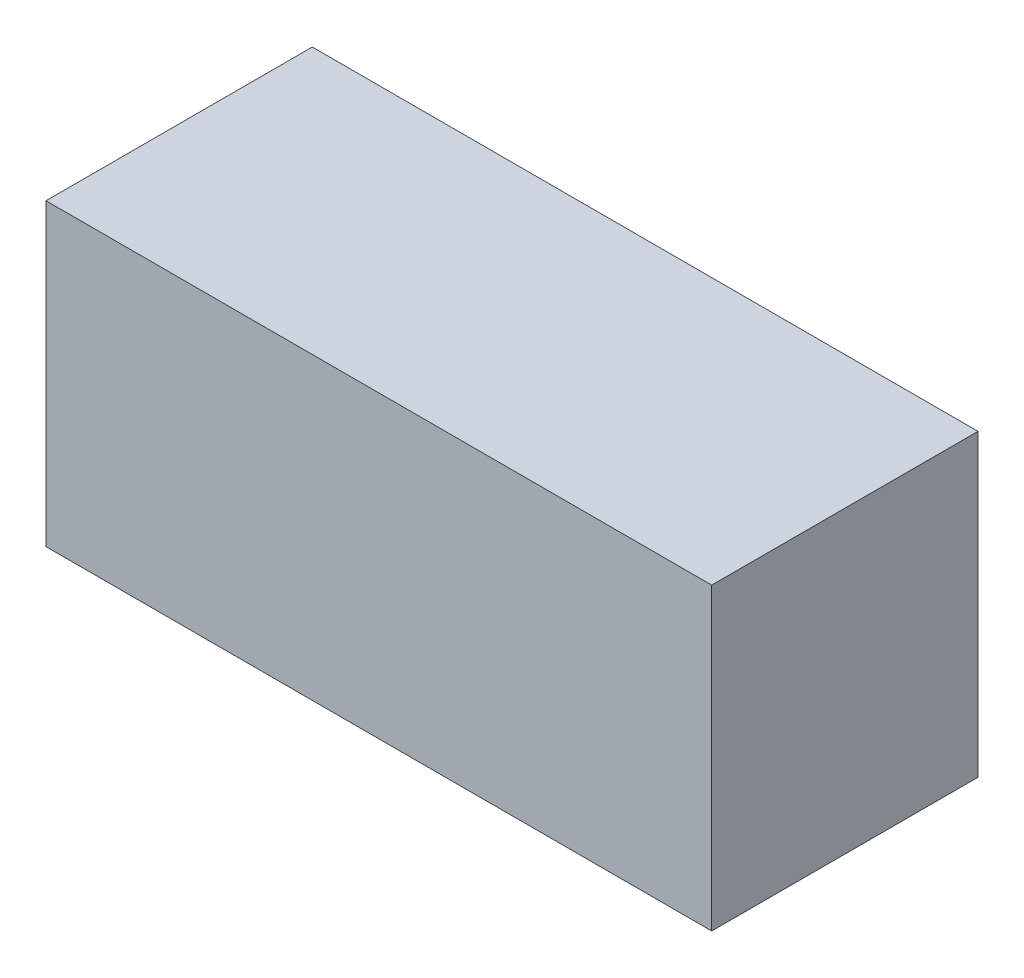
ISO-10303-21;
HEADER;
FILE_DESCRIPTION(('STEP AP214'),'2;1');
FILE_NAME('part.step','',(''),(''),'','','');
FILE_SCHEMA(('AUTOMOTIVE_DESIGN { 1 0 10303 214 1 1 1 1 }'));
ENDSEC;
DATA;
#1=APPLICATION_CONTEXT('core data for automotive mechanical design processes');
#2=APPLICATION_PROTOCOL_DEFINITION('international standard','automotive_design',2000,#1);
#3=PRODUCT_CONTEXT('',#1,'mechanical');
#4=PRODUCT('Part','Part','',(#3));
#5=PRODUCT_RELATED_PRODUCT_CATEGORY('part','',(#4));
#6=PRODUCT_DEFINITION_FORMATION('','',#4);
#7=PRODUCT_DEFINITION_CONTEXT('part definition',#1,'design');
#8=PRODUCT_DEFINITION('design','',#6,#7);
#9=PRODUCT_DEFINITION_SHAPE('','',#8);
#10=(LENGTH_UNIT() NAMED_UNIT(*) SI_UNIT(.MILLI.,.METRE.));
#11=(NAMED_UNIT(*) PLANE_ANGLE_UNIT() SI_UNIT($,.RADIAN.));
#12=(NAMED_UNIT(*) SI_UNIT($,.STERADIAN.) SOLID_ANGLE_UNIT());
#13=UNCERTAINTY_MEASURE_WITH_UNIT(LENGTH_MEASURE(1.E-05),#10,'distance_accuracy_value','');
#14=(GEOMETRIC_REPRESENTATION_CONTEXT(3) GLOBAL_UNCERTAINTY_ASSIGNED_CONTEXT((#13)) GLOBAL_UNIT_ASSIGNED_CONTEXT((#10,
#11,#12)) REPRESENTATION_CONTEXT('',''));
#15=CARTESIAN_POINT('',(0.,0.,0.));
#16=DIRECTION('',(0.,0.,1.));
#17=DIRECTION('',(1.,0.,0.));
#18=AXIS2_PLACEMENT_3D('',#15,#16,#17);
#19=CARTESIAN_POINT('',(127.,6.35,-50.8));
#20=DIRECTION('',(-1.,0.,0.));
#21=DIRECTION('',(0.,0.,1.));
#22=AXIS2_PLACEMENT_3D('',#19,#20,#21);
#23=PLANE('',#22);
#24=DIRECTION('',(0.,0.,-1.));
#25=VECTOR('',#24,1.);
#26=CARTESIAN_POINT('',(127.,0.,-50.8));
#27=LINE('',#26,#25);
#28=CARTESIAN_POINT('',(127.,0.,50.8));
#29=VERTEX_POINT('',#28);
#30=CARTESIAN_POINT('',(127.,0.,-50.8));
#31=VERTEX_POINT('',#30);
#32=EDGE_CURVE('E158',#29,#31,#27,.T.);
#33=ORIENTED_EDGE('',*,*,#32,.T.);
#34=DIRECTION('',(0.,-1.,0.));
#35=VECTOR('',#34,1.);
#36=CARTESIAN_POINT('',(127.,6.35,-50.8));
#37=LINE('',#36,#35);
#38=CARTESIAN_POINT('',(127.,114.3,-50.8));
#39=VERTEX_POINT('',#38);
#40=EDGE_CURVE('E11',#39,#31,#37,.T.);
#41=ORIENTED_EDGE('',*,*,#40,.F.);
#42=DIRECTION('',(0.,0.,-1.));
#43=VECTOR('',#42,1.);
#44=CARTESIAN_POINT('',(127.,114.3,50.8));
#45=LINE('',#44,#43);
#46=CARTESIAN_POINT('',(127.,114.3,50.8));
#47=VERTEX_POINT('',#46);
#48=EDGE_CURVE('E119',#47,#39,#45,.T.);
#49=ORIENTED_EDGE('',*,*,#48,.F.);
#50=DIRECTION('',(0.,-1.,0.));
#51=VECTOR('',#50,1.);
#52=CARTESIAN_POINT('',(127.,6.35,50.8));
#53=LINE('',#52,#51);
#54=EDGE_CURVE('E110',#47,#29,#53,.T.);
#55=ORIENTED_EDGE('',*,*,#54,.T.);
#56=EDGE_LOOP('',(#33,#41,#49,#55));
#57=FACE_BOUND('',#56,.T.);
#58=ADVANCED_FACE('F37',(#57),#23,.F.);
#59=CARTESIAN_POINT('',(-127.,6.35,-50.8));
#60=DIRECTION('',(0.,0.,1.));
#61=DIRECTION('',(1.,0.,0.));
#62=AXIS2_PLACEMENT_3D('',#59,#60,#61);
#63=PLANE('',#62);
#64=DIRECTION('',(-1.,0.,0.));
#65=VECTOR('',#64,1.);
#66=CARTESIAN_POINT('',(-127.,0.,-50.8));
#67=LINE('',#66,#65);
#68=CARTESIAN_POINT('',(-127.,0.,-50.8));
#69=VERTEX_POINT('',#68);
#70=EDGE_CURVE('E161',#31,#69,#67,.T.);
#71=ORIENTED_EDGE('',*,*,#70,.T.);
#72=DIRECTION('',(0.,-1.,0.));
#73=VECTOR('',#72,1.);
#74=CARTESIAN_POINT('',(-127.,6.35,-50.8));
#75=LINE('',#74,#73);
#76=CARTESIAN_POINT('',(-127.,114.3,-50.8));
#77=VERTEX_POINT('',#76);
#78=EDGE_CURVE('E45',#77,#69,#75,.T.);
#79=ORIENTED_EDGE('',*,*,#78,.F.);
#80=DIRECTION('',(-1.,0.,0.));
#81=VECTOR('',#80,1.);
#82=CARTESIAN_POINT('',(-127.,114.3,-50.8));
#83=LINE('',#82,#81);
#84=EDGE_CURVE('E124',#39,#77,#83,.T.);
#85=ORIENTED_EDGE('',*,*,#84,.F.);
#86=ORIENTED_EDGE('',*,*,#40,.T.);
#87=EDGE_LOOP('',(#71,#79,#85,#86));
#88=FACE_BOUND('',#87,.T.);
#89=ADVANCED_FACE('F171',(#88),#63,.F.);
#90=CARTESIAN_POINT('',(-127.,6.35,-50.8));
#91=DIRECTION('',(1.,0.,0.));
#92=DIRECTION('',(0.,0.,-1.));
#93=AXIS2_PLACEMENT_3D('',#90,#91,#92);
#94=PLANE('',#93);
#95=DIRECTION('',(0.,0.,1.));
#96=VECTOR('',#95,1.);
#97=CARTESIAN_POINT('',(-127.,0.,-50.8));
#98=LINE('',#97,#96);
#99=CARTESIAN_POINT('',(-127.,0.,50.8));
#100=VERTEX_POINT('',#99);
#101=EDGE_CURVE('E107',#69,#100,#98,.T.);
#102=ORIENTED_EDGE('',*,*,#101,.T.);
#103=DIRECTION('',(0.,-1.,0.));
#104=VECTOR('',#103,1.);
#105=CARTESIAN_POINT('',(-127.,6.35,50.8));
#106=LINE('',#105,#104);
#107=CARTESIAN_POINT('',(-127.,114.3,50.8));
#108=VERTEX_POINT('',#107);
#109=EDGE_CURVE('E100',#108,#100,#106,.T.);
#110=ORIENTED_EDGE('',*,*,#109,.F.);
#111=DIRECTION('',(0.,0.,1.));
#112=VECTOR('',#111,1.);
#113=CARTESIAN_POINT('',(-127.,114.3,50.8));
#114=LINE('',#113,#112);
#115=EDGE_CURVE('E105',#77,#108,#114,.T.);
#116=ORIENTED_EDGE('',*,*,#115,.F.);
#117=ORIENTED_EDGE('',*,*,#78,.T.);
#118=EDGE_LOOP('',(#102,#110,#116,#117));
#119=FACE_BOUND('',#118,.T.);
#120=ADVANCED_FACE('F102',(#119),#94,.F.);
#121=CARTESIAN_POINT('',(-127.,6.35,50.8));
#122=DIRECTION('',(0.,0.,-1.));
#123=DIRECTION('',(-1.,0.,0.));
#124=AXIS2_PLACEMENT_3D('',#121,#122,#123);
#125=PLANE('',#124);
#126=DIRECTION('',(1.,0.,0.));
#127=VECTOR('',#126,1.);
#128=CARTESIAN_POINT('',(-127.,0.,50.8));
#129=LINE('',#128,#127);
#130=EDGE_CURVE('E164',#100,#29,#129,.T.);
#131=ORIENTED_EDGE('',*,*,#130,.T.);
#132=ORIENTED_EDGE('',*,*,#54,.F.);
#133=DIRECTION('',(1.,0.,0.));
#134=VECTOR('',#133,1.);
#135=CARTESIAN_POINT('',(-127.,114.3,50.8));
#136=LINE('',#135,#134);
#137=EDGE_CURVE('E113',#108,#47,#136,.T.);
#138=ORIENTED_EDGE('',*,*,#137,.F.);
#139=ORIENTED_EDGE('',*,*,#109,.T.);
#140=EDGE_LOOP('',(#131,#132,#138,#139));
#141=FACE_BOUND('',#140,.T.);
#142=ADVANCED_FACE('F114',(#141),#125,.F.);
#143=CARTESIAN_POINT('',(0.,0.,0.));
#144=DIRECTION('',(0.,1.,0.));
#145=DIRECTION('',(0.,0.,1.));
#146=AXIS2_PLACEMENT_3D('',#143,#144,#145);
#147=PLANE('',#146);
#148=ORIENTED_EDGE('',*,*,#32,.F.);
#149=ORIENTED_EDGE('',*,*,#130,.F.);
#150=ORIENTED_EDGE('',*,*,#101,.F.);
#151=ORIENTED_EDGE('',*,*,#70,.F.);
#152=EDGE_LOOP('',(#148,#149,#150,#151));
#153=FACE_BOUND('',#152,.T.);
#154=ADVANCED_FACE('F169',(#153),#147,.F.);
#155=CARTESIAN_POINT('',(0.,114.3,0.));
#156=DIRECTION('',(0.,-1.,0.));
#157=DIRECTION('',(0.,0.,-1.));
#158=AXIS2_PLACEMENT_3D('',#155,#156,#157);
#159=PLANE('',#158);
#160=ORIENTED_EDGE('',*,*,#115,.T.);
#161=ORIENTED_EDGE('',*,*,#137,.T.);
#162=ORIENTED_EDGE('',*,*,#48,.T.);
#163=ORIENTED_EDGE('',*,*,#84,.T.);
#164=EDGE_LOOP('',(#160,#161,#162,#163));
#165=FACE_BOUND('',#164,.T.);
#166=ADVANCED_FACE('F122',(#165),#159,.F.);
#167=CLOSED_SHELL('',(#58,#89,#120,#142,#154,#166));
#168=CARTESIAN_POINT('',(0.,6.35,0.));
#169=DIRECTION('',(0.,1.,0.));
#170=DIRECTION('',(0.,0.,1.));
#171=AXIS2_PLACEMENT_3D('',#168,#169,#170);
#172=PLANE('',#171);
#173=DIRECTION('',(1.,0.,0.));
#174=VECTOR('',#173,1.);
#175=CARTESIAN_POINT('',(-120.65,6.35,44.45));
#176=LINE('',#175,#174);
#177=CARTESIAN_POINT('',(-120.65,6.35,44.45));
#178=VERTEX_POINT('',#177);
#179=CARTESIAN_POINT('',(120.65,6.35,44.45));
#180=VERTEX_POINT('',#179);
#181=EDGE_CURVE('E52',#178,#180,#176,.T.);
#182=ORIENTED_EDGE('',*,*,#181,.T.);
#183=DIRECTION('',(0.,0.,-1.));
#184=VECTOR('',#183,1.);
#185=CARTESIAN_POINT('',(120.65,6.35,44.45));
#186=LINE('',#185,#184);
#187=CARTESIAN_POINT('',(120.65,6.35,-44.45));
#188=VERTEX_POINT('',#187);
#189=EDGE_CURVE('E56',#180,#188,#186,.T.);
#190=ORIENTED_EDGE('',*,*,#189,.T.);
#191=DIRECTION('',(-1.,0.,0.));
#192=VECTOR('',#191,1.);
#193=CARTESIAN_POINT('',(120.65,6.35,-44.45));
#194=LINE('',#193,#192);
#195=CARTESIAN_POINT('',(-120.65,6.35,-44.45));
#196=VERTEX_POINT('',#195);
#197=EDGE_CURVE('E145',#188,#196,#194,.T.);
#198=ORIENTED_EDGE('',*,*,#197,.T.);
#199=DIRECTION('',(0.,0.,1.));
#200=VECTOR('',#199,1.);
#201=CARTESIAN_POINT('',(-120.65,6.35,-44.45));
#202=LINE('',#201,#200);
#203=EDGE_CURVE('E133',#196,#178,#202,.T.);
#204=ORIENTED_EDGE('',*,*,#203,.T.);
#205=EDGE_LOOP('',(#182,#190,#198,#204));
#206=FACE_BOUND('',#205,.T.);
#207=ADVANCED_FACE('F183',(#206),#172,.T.);
#208=CARTESIAN_POINT('',(120.65,107.95,-44.45));
#209=DIRECTION('',(0.,0.,1.));
#210=DIRECTION('',(1.,0.,0.));
#211=AXIS2_PLACEMENT_3D('',#208,#209,#210);
#212=PLANE('',#211);
#213=ORIENTED_EDGE('',*,*,#197,.F.);
#214=DIRECTION('',(0.,-1.,0.));
#215=VECTOR('',#214,1.);
#216=CARTESIAN_POINT('',(120.65,107.95,-44.45));
#217=LINE('',#216,#215);
#218=CARTESIAN_POINT('',(120.65,107.95,-44.45));
#219=VERTEX_POINT('',#218);
#220=EDGE_CURVE('E153',#219,#188,#217,.T.);
#221=ORIENTED_EDGE('',*,*,#220,.F.);
#222=DIRECTION('',(-1.,0.,0.));
#223=VECTOR('',#222,1.);
#224=CARTESIAN_POINT('',(120.65,107.95,-44.45));
#225=LINE('',#224,#223);
#226=CARTESIAN_POINT('',(-120.65,107.95,-44.45));
#227=VERTEX_POINT('',#226);
#228=EDGE_CURVE('E136',#219,#227,#225,.T.);
#229=ORIENTED_EDGE('',*,*,#228,.T.);
#230=DIRECTION('',(0.,-1.,0.));
#231=VECTOR('',#230,1.);
#232=CARTESIAN_POINT('',(-120.65,107.95,-44.45));
#233=LINE('',#232,#231);
#234=EDGE_CURVE('E150',#227,#196,#233,.T.);
#235=ORIENTED_EDGE('',*,*,#234,.T.);
#236=EDGE_LOOP('',(#213,#221,#229,#235));
#237=FACE_BOUND('',#236,.T.);
#238=ADVANCED_FACE('F186',(#237),#212,.T.);
#239=CARTESIAN_POINT('',(-120.65,107.95,-44.45));
#240=DIRECTION('',(1.,0.,0.));
#241=DIRECTION('',(0.,0.,-1.));
#242=AXIS2_PLACEMENT_3D('',#239,#240,#241);
#243=PLANE('',#242);
#244=ORIENTED_EDGE('',*,*,#203,.F.);
#245=ORIENTED_EDGE('',*,*,#234,.F.);
#246=DIRECTION('',(0.,0.,1.));
#247=VECTOR('',#246,1.);
#248=CARTESIAN_POINT('',(-120.65,107.95,-44.45));
#249=LINE('',#248,#247);
#250=CARTESIAN_POINT('',(-120.65,107.95,44.45));
#251=VERTEX_POINT('',#250);
#252=EDGE_CURVE('E139',#227,#251,#249,.T.);
#253=ORIENTED_EDGE('',*,*,#252,.T.);
#254=DIRECTION('',(0.,-1.,0.));
#255=VECTOR('',#254,1.);
#256=CARTESIAN_POINT('',(-120.65,107.95,44.45));
#257=LINE('',#256,#255);
#258=EDGE_CURVE('E142',#251,#178,#257,.T.);
#259=ORIENTED_EDGE('',*,*,#258,.T.);
#260=EDGE_LOOP('',(#244,#245,#253,#259));
#261=FACE_BOUND('',#260,.T.);
#262=ADVANCED_FACE('F192',(#261),#243,.T.);
#263=CARTESIAN_POINT('',(-120.65,107.95,44.45));
#264=DIRECTION('',(0.,0.,-1.));
#265=DIRECTION('',(-1.,0.,0.));
#266=AXIS2_PLACEMENT_3D('',#263,#264,#265);
#267=PLANE('',#266);
#268=ORIENTED_EDGE('',*,*,#181,.F.);
#269=ORIENTED_EDGE('',*,*,#258,.F.);
#270=DIRECTION('',(1.,0.,0.));
#271=VECTOR('',#270,1.);
#272=CARTESIAN_POINT('',(-120.65,107.95,44.45));
#273=LINE('',#272,#271);
#274=CARTESIAN_POINT('',(120.65,107.95,44.45));
#275=VERTEX_POINT('',#274);
#276=EDGE_CURVE('E129',#251,#275,#273,.T.);
#277=ORIENTED_EDGE('',*,*,#276,.T.);
#278=DIRECTION('',(0.,-1.,0.));
#279=VECTOR('',#278,1.);
#280=CARTESIAN_POINT('',(120.65,107.95,44.45));
#281=LINE('',#280,#279);
#282=EDGE_CURVE('E155',#275,#180,#281,.T.);
#283=ORIENTED_EDGE('',*,*,#282,.T.);
#284=EDGE_LOOP('',(#268,#269,#277,#283));
#285=FACE_BOUND('',#284,.T.);
#286=ADVANCED_FACE('F188',(#285),#267,.T.);
#287=CARTESIAN_POINT('',(120.65,107.95,44.45));
#288=DIRECTION('',(-1.,0.,0.));
#289=DIRECTION('',(0.,0.,1.));
#290=AXIS2_PLACEMENT_3D('',#287,#288,#289);
#291=PLANE('',#290);
#292=ORIENTED_EDGE('',*,*,#189,.F.);
#293=ORIENTED_EDGE('',*,*,#282,.F.);
#294=DIRECTION('',(0.,0.,-1.));
#295=VECTOR('',#294,1.);
#296=CARTESIAN_POINT('',(120.65,107.95,44.45));
#297=LINE('',#296,#295);
#298=EDGE_CURVE('E132',#275,#219,#297,.T.);
#299=ORIENTED_EDGE('',*,*,#298,.T.);
#300=ORIENTED_EDGE('',*,*,#220,.T.);
#301=EDGE_LOOP('',(#292,#293,#299,#300));
#302=FACE_BOUND('',#301,.T.);
#303=ADVANCED_FACE('F191',(#302),#291,.T.);
#304=CARTESIAN_POINT('',(0.,107.95,0.));
#305=DIRECTION('',(0.,-1.,0.));
#306=DIRECTION('',(0.,0.,-1.));
#307=AXIS2_PLACEMENT_3D('',#304,#305,#306);
#308=PLANE('',#307);
#309=ORIENTED_EDGE('',*,*,#298,.F.);
#310=ORIENTED_EDGE('',*,*,#276,.F.);
#311=ORIENTED_EDGE('',*,*,#252,.F.);
#312=ORIENTED_EDGE('',*,*,#228,.F.);
#313=EDGE_LOOP('',(#309,#310,#311,#312));
#314=FACE_BOUND('',#313,.T.);
#315=ADVANCED_FACE('F196',(#314),#308,.T.);
#316=CLOSED_SHELL('',(#207,#238,#262,#286,#303,#315));
#317=ORIENTED_CLOSED_SHELL('',*,#316,.T.);
#318=BREP_WITH_VOIDS('B2',#167,(#317));
#319=ADVANCED_BREP_SHAPE_REPRESENTATION('',(#18,#318),#14);
#320=SHAPE_DEFINITION_REPRESENTATION(#9,#319);
ENDSEC;
END-ISO-10303-21;
